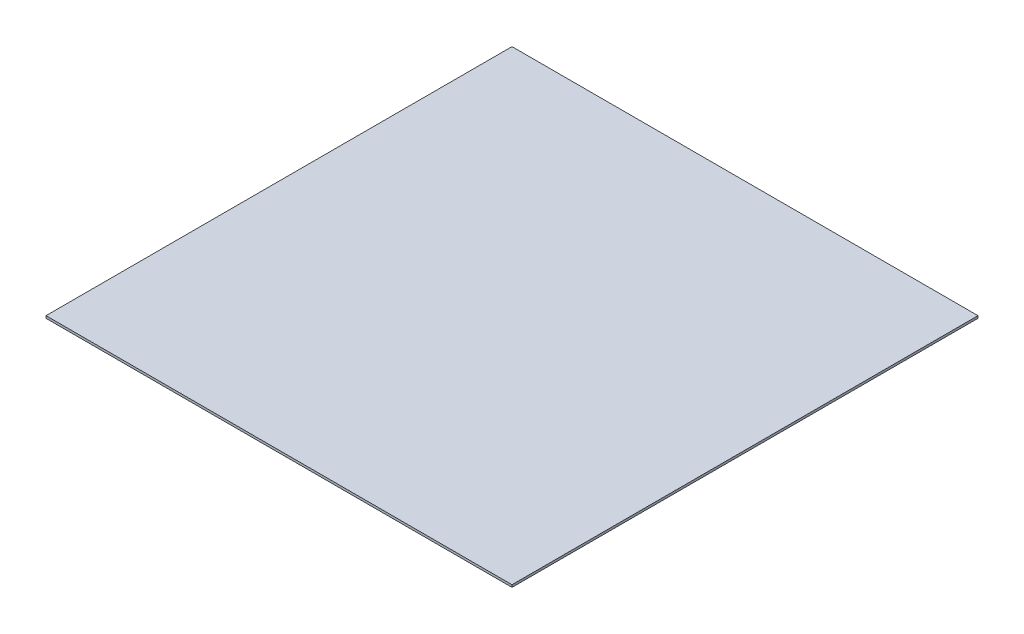
ISO-10303-21;
HEADER;
FILE_DESCRIPTION(('STEP AP214'),'2;1');
FILE_NAME('part.step','',(''),(''),'','','');
FILE_SCHEMA(('AUTOMOTIVE_DESIGN { 1 0 10303 214 1 1 1 1 }'));
ENDSEC;
DATA;
#1=APPLICATION_CONTEXT('core data for automotive mechanical design processes');
#2=APPLICATION_PROTOCOL_DEFINITION('international standard','automotive_design',2000,#1);
#3=PRODUCT_CONTEXT('',#1,'mechanical');
#4=PRODUCT('Part','Part','',(#3));
#5=PRODUCT_RELATED_PRODUCT_CATEGORY('part','',(#4));
#6=PRODUCT_DEFINITION_FORMATION('','',#4);
#7=PRODUCT_DEFINITION_CONTEXT('part definition',#1,'design');
#8=PRODUCT_DEFINITION('design','',#6,#7);
#9=PRODUCT_DEFINITION_SHAPE('','',#8);
#10=(LENGTH_UNIT() NAMED_UNIT(*) SI_UNIT(.MILLI.,.METRE.));
#11=(NAMED_UNIT(*) PLANE_ANGLE_UNIT() SI_UNIT($,.RADIAN.));
#12=(NAMED_UNIT(*) SI_UNIT($,.STERADIAN.) SOLID_ANGLE_UNIT());
#13=UNCERTAINTY_MEASURE_WITH_UNIT(LENGTH_MEASURE(1.E-05),#10,'distance_accuracy_value','');
#14=(GEOMETRIC_REPRESENTATION_CONTEXT(3) GLOBAL_UNCERTAINTY_ASSIGNED_CONTEXT((#13)) GLOBAL_UNIT_ASSIGNED_CONTEXT((#10,
#11,#12)) REPRESENTATION_CONTEXT('',''));
#15=CARTESIAN_POINT('',(0.,0.,0.));
#16=DIRECTION('',(0.,0.,1.));
#17=DIRECTION('',(1.,0.,0.));
#18=AXIS2_PLACEMENT_3D('',#15,#16,#17);
#19=CARTESIAN_POINT('',(-100.,0.5,-95.4111467502691));
#20=DIRECTION('',(1.,0.,0.));
#21=DIRECTION('',(0.,0.,-1.));
#22=AXIS2_PLACEMENT_3D('',#19,#20,#21);
#23=PLANE('',#22);
#24=DIRECTION('',(0.,0.,1.));
#25=VECTOR('',#24,1.);
#26=CARTESIAN_POINT('',(-100.,0.,-95.4111467502691));
#27=LINE('',#26,#25);
#28=CARTESIAN_POINT('',(-100.,0.,-95.4111467502691));
#29=VERTEX_POINT('',#28);
#30=CARTESIAN_POINT('',(-100.,0.,4.58885324973093));
#31=VERTEX_POINT('',#30);
#32=EDGE_CURVE('E98',#29,#31,#27,.T.);
#33=ORIENTED_EDGE('',*,*,#32,.T.);
#34=DIRECTION('',(0.,-1.,0.));
#35=VECTOR('',#34,1.);
#36=CARTESIAN_POINT('',(-100.,0.5,4.58885324973093));
#37=LINE('',#36,#35);
#38=CARTESIAN_POINT('',(-100.,0.5,4.58885324973093));
#39=VERTEX_POINT('',#38);
#40=EDGE_CURVE('E11',#39,#31,#37,.T.);
#41=ORIENTED_EDGE('',*,*,#40,.F.);
#42=DIRECTION('',(0.,0.,1.));
#43=VECTOR('',#42,1.);
#44=CARTESIAN_POINT('',(-100.,0.5,-95.4111467502691));
#45=LINE('',#44,#43);
#46=CARTESIAN_POINT('',(-100.,0.5,-95.4111467502691));
#47=VERTEX_POINT('',#46);
#48=EDGE_CURVE('E86',#47,#39,#45,.T.);
#49=ORIENTED_EDGE('',*,*,#48,.F.);
#50=DIRECTION('',(0.,-1.,0.));
#51=VECTOR('',#50,1.);
#52=CARTESIAN_POINT('',(-100.,0.5,-95.4111467502691));
#53=LINE('',#52,#51);
#54=EDGE_CURVE('E94',#47,#29,#53,.T.);
#55=ORIENTED_EDGE('',*,*,#54,.T.);
#56=EDGE_LOOP('',(#33,#41,#49,#55));
#57=FACE_BOUND('',#56,.T.);
#58=ADVANCED_FACE('F35',(#57),#23,.F.);
#59=CARTESIAN_POINT('',(-100.,0.5,4.58885324973093));
#60=DIRECTION('',(0.,0.,-1.));
#61=DIRECTION('',(-1.,0.,0.));
#62=AXIS2_PLACEMENT_3D('',#59,#60,#61);
#63=PLANE('',#62);
#64=DIRECTION('',(1.,0.,0.));
#65=VECTOR('',#64,1.);
#66=CARTESIAN_POINT('',(-100.,0.,4.58885324973093));
#67=LINE('',#66,#65);
#68=CARTESIAN_POINT('',(0.,0.,4.58885324973093));
#69=VERTEX_POINT('',#68);
#70=EDGE_CURVE('E90',#31,#69,#67,.T.);
#71=ORIENTED_EDGE('',*,*,#70,.T.);
#72=DIRECTION('',(0.,-1.,0.));
#73=VECTOR('',#72,1.);
#74=CARTESIAN_POINT('',(0.,0.5,4.58885324973093));
#75=LINE('',#74,#73);
#76=CARTESIAN_POINT('',(0.,0.5,4.58885324973093));
#77=VERTEX_POINT('',#76);
#78=EDGE_CURVE('E43',#77,#69,#75,.T.);
#79=ORIENTED_EDGE('',*,*,#78,.F.);
#80=DIRECTION('',(1.,0.,0.));
#81=VECTOR('',#80,1.);
#82=CARTESIAN_POINT('',(-100.,0.5,4.58885324973093));
#83=LINE('',#82,#81);
#84=EDGE_CURVE('E81',#39,#77,#83,.T.);
#85=ORIENTED_EDGE('',*,*,#84,.F.);
#86=ORIENTED_EDGE('',*,*,#40,.T.);
#87=EDGE_LOOP('',(#71,#79,#85,#86));
#88=FACE_BOUND('',#87,.T.);
#89=ADVANCED_FACE('F89',(#88),#63,.F.);
#90=CARTESIAN_POINT('',(0.,0.5,-95.4111467502691));
#91=DIRECTION('',(-1.,0.,0.));
#92=DIRECTION('',(0.,0.,1.));
#93=AXIS2_PLACEMENT_3D('',#90,#91,#92);
#94=PLANE('',#93);
#95=DIRECTION('',(0.,0.,-1.));
#96=VECTOR('',#95,1.);
#97=CARTESIAN_POINT('',(0.,0.,-95.4111467502691));
#98=LINE('',#97,#96);
#99=CARTESIAN_POINT('',(0.,0.,-95.4111467502691));
#100=VERTEX_POINT('',#99);
#101=EDGE_CURVE('E68',#69,#100,#98,.T.);
#102=ORIENTED_EDGE('',*,*,#101,.T.);
#103=DIRECTION('',(0.,-1.,0.));
#104=VECTOR('',#103,1.);
#105=CARTESIAN_POINT('',(0.,0.5,-95.4111467502691));
#106=LINE('',#105,#104);
#107=CARTESIAN_POINT('',(0.,0.5,-95.4111467502691));
#108=VERTEX_POINT('',#107);
#109=EDGE_CURVE('E91',#108,#100,#106,.T.);
#110=ORIENTED_EDGE('',*,*,#109,.F.);
#111=DIRECTION('',(0.,0.,-1.));
#112=VECTOR('',#111,1.);
#113=CARTESIAN_POINT('',(0.,0.5,-95.4111467502691));
#114=LINE('',#113,#112);
#115=EDGE_CURVE('E84',#77,#108,#114,.T.);
#116=ORIENTED_EDGE('',*,*,#115,.F.);
#117=ORIENTED_EDGE('',*,*,#78,.T.);
#118=EDGE_LOOP('',(#102,#110,#116,#117));
#119=FACE_BOUND('',#118,.T.);
#120=ADVANCED_FACE('F92',(#119),#94,.F.);
#121=CARTESIAN_POINT('',(-100.,0.5,-95.4111467502691));
#122=DIRECTION('',(0.,0.,1.));
#123=DIRECTION('',(1.,0.,0.));
#124=AXIS2_PLACEMENT_3D('',#121,#122,#123);
#125=PLANE('',#124);
#126=DIRECTION('',(-1.,0.,0.));
#127=VECTOR('',#126,1.);
#128=CARTESIAN_POINT('',(-100.,0.,-95.4111467502691));
#129=LINE('',#128,#127);
#130=EDGE_CURVE('E74',#100,#29,#129,.T.);
#131=ORIENTED_EDGE('',*,*,#130,.T.);
#132=ORIENTED_EDGE('',*,*,#54,.F.);
#133=DIRECTION('',(-1.,0.,0.));
#134=VECTOR('',#133,1.);
#135=CARTESIAN_POINT('',(-100.,0.5,-95.4111467502691));
#136=LINE('',#135,#134);
#137=EDGE_CURVE('E51',#108,#47,#136,.T.);
#138=ORIENTED_EDGE('',*,*,#137,.F.);
#139=ORIENTED_EDGE('',*,*,#109,.T.);
#140=EDGE_LOOP('',(#131,#132,#138,#139));
#141=FACE_BOUND('',#140,.T.);
#142=ADVANCED_FACE('F105',(#141),#125,.F.);
#143=CARTESIAN_POINT('',(0.,0.5,0.));
#144=DIRECTION('',(0.,1.,0.));
#145=DIRECTION('',(0.,0.,1.));
#146=AXIS2_PLACEMENT_3D('',#143,#144,#145);
#147=PLANE('',#146);
#148=ORIENTED_EDGE('',*,*,#48,.T.);
#149=ORIENTED_EDGE('',*,*,#84,.T.);
#150=ORIENTED_EDGE('',*,*,#115,.T.);
#151=ORIENTED_EDGE('',*,*,#137,.T.);
#152=EDGE_LOOP('',(#148,#149,#150,#151));
#153=FACE_BOUND('',#152,.T.);
#154=ADVANCED_FACE('F82',(#153),#147,.T.);
#155=CARTESIAN_POINT('',(0.,0.,0.));
#156=DIRECTION('',(0.,1.,0.));
#157=DIRECTION('',(0.,0.,1.));
#158=AXIS2_PLACEMENT_3D('',#155,#156,#157);
#159=PLANE('',#158);
#160=ORIENTED_EDGE('',*,*,#32,.F.);
#161=ORIENTED_EDGE('',*,*,#130,.F.);
#162=ORIENTED_EDGE('',*,*,#101,.F.);
#163=ORIENTED_EDGE('',*,*,#70,.F.);
#164=EDGE_LOOP('',(#160,#161,#162,#163));
#165=FACE_BOUND('',#164,.T.);
#166=ADVANCED_FACE('F108',(#165),#159,.F.);
#167=CLOSED_SHELL('',(#58,#89,#120,#142,#154,#166));
#168=MANIFOLD_SOLID_BREP('B2',#167);
#169=ADVANCED_BREP_SHAPE_REPRESENTATION('',(#18,#168),#14);
#170=SHAPE_DEFINITION_REPRESENTATION(#9,#169);
ENDSEC;
END-ISO-10303-21;
